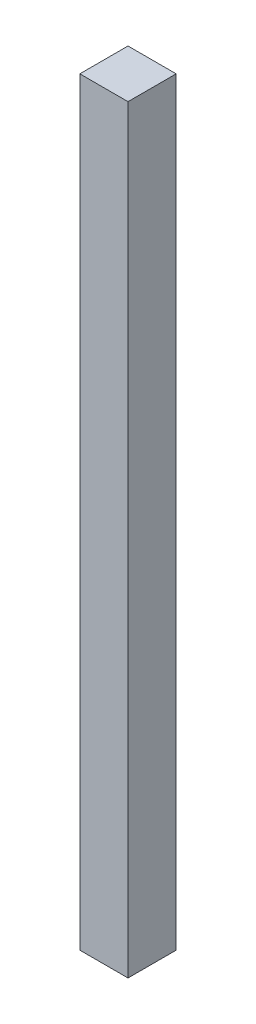
ISO-10303-21;
HEADER;
FILE_DESCRIPTION(('STEP AP214'),'2;1');
FILE_NAME('part.step','',(''),(''),'','','');
FILE_SCHEMA(('AUTOMOTIVE_DESIGN { 1 0 10303 214 1 1 1 1 }'));
ENDSEC;
DATA;
#1=APPLICATION_CONTEXT('core data for automotive mechanical design processes');
#2=APPLICATION_PROTOCOL_DEFINITION('international standard','automotive_design',2000,#1);
#3=PRODUCT_CONTEXT('',#1,'mechanical');
#4=PRODUCT('Part','Part','',(#3));
#5=PRODUCT_RELATED_PRODUCT_CATEGORY('part','',(#4));
#6=PRODUCT_DEFINITION_FORMATION('','',#4);
#7=PRODUCT_DEFINITION_CONTEXT('part definition',#1,'design');
#8=PRODUCT_DEFINITION('design','',#6,#7);
#9=PRODUCT_DEFINITION_SHAPE('','',#8);
#10=(LENGTH_UNIT() NAMED_UNIT(*) SI_UNIT(.MILLI.,.METRE.));
#11=(NAMED_UNIT(*) PLANE_ANGLE_UNIT() SI_UNIT($,.RADIAN.));
#12=(NAMED_UNIT(*) SI_UNIT($,.STERADIAN.) SOLID_ANGLE_UNIT());
#13=UNCERTAINTY_MEASURE_WITH_UNIT(LENGTH_MEASURE(1.E-05),#10,'distance_accuracy_value','');
#14=(GEOMETRIC_REPRESENTATION_CONTEXT(3) GLOBAL_UNCERTAINTY_ASSIGNED_CONTEXT((#13)) GLOBAL_UNIT_ASSIGNED_CONTEXT((#10,
#11,#12)) REPRESENTATION_CONTEXT('',''));
#15=CARTESIAN_POINT('',(0.,0.,0.));
#16=DIRECTION('',(0.,0.,1.));
#17=DIRECTION('',(1.,0.,0.));
#18=AXIS2_PLACEMENT_3D('',#15,#16,#17);
#19=CARTESIAN_POINT('',(-2.,63.,-2.));
#20=DIRECTION('',(1.,0.,0.));
#21=DIRECTION('',(0.,0.,-1.));
#22=AXIS2_PLACEMENT_3D('',#19,#20,#21);
#23=PLANE('',#22);
#24=DIRECTION('',(0.,0.,1.));
#25=VECTOR('',#24,1.);
#26=CARTESIAN_POINT('',(-2.,0.,-2.));
#27=LINE('',#26,#25);
#28=CARTESIAN_POINT('',(-2.,0.,-2.));
#29=VERTEX_POINT('',#28);
#30=CARTESIAN_POINT('',(-2.,0.,2.));
#31=VERTEX_POINT('',#30);
#32=EDGE_CURVE('E107',#29,#31,#27,.T.);
#33=ORIENTED_EDGE('',*,*,#32,.T.);
#34=DIRECTION('',(0.,-1.,0.));
#35=VECTOR('',#34,1.);
#36=CARTESIAN_POINT('',(-2.,63.,2.));
#37=LINE('',#36,#35);
#38=CARTESIAN_POINT('',(-2.,63.,2.));
#39=VERTEX_POINT('',#38);
#40=EDGE_CURVE('E11',#39,#31,#37,.T.);
#41=ORIENTED_EDGE('',*,*,#40,.F.);
#42=DIRECTION('',(0.,0.,1.));
#43=VECTOR('',#42,1.);
#44=CARTESIAN_POINT('',(-2.,63.,-2.));
#45=LINE('',#44,#43);
#46=CARTESIAN_POINT('',(-2.,63.,-2.));
#47=VERTEX_POINT('',#46);
#48=EDGE_CURVE('E91',#47,#39,#45,.T.);
#49=ORIENTED_EDGE('',*,*,#48,.F.);
#50=DIRECTION('',(0.,-1.,0.));
#51=VECTOR('',#50,1.);
#52=CARTESIAN_POINT('',(-2.,63.,-2.));
#53=LINE('',#52,#51);
#54=EDGE_CURVE('E103',#47,#29,#53,.T.);
#55=ORIENTED_EDGE('',*,*,#54,.T.);
#56=EDGE_LOOP('',(#33,#41,#49,#55));
#57=FACE_BOUND('',#56,.T.);
#58=ADVANCED_FACE('F39',(#57),#23,.F.);
#59=CARTESIAN_POINT('',(2.,63.,2.));
#60=DIRECTION('',(0.,0.,-1.));
#61=DIRECTION('',(-1.,0.,0.));
#62=AXIS2_PLACEMENT_3D('',#59,#60,#61);
#63=PLANE('',#62);
#64=DIRECTION('',(1.,0.,0.));
#65=VECTOR('',#64,1.);
#66=CARTESIAN_POINT('',(2.,0.,2.));
#67=LINE('',#66,#65);
#68=CARTESIAN_POINT('',(2.,0.,2.));
#69=VERTEX_POINT('',#68);
#70=EDGE_CURVE('E96',#31,#69,#67,.T.);
#71=ORIENTED_EDGE('',*,*,#70,.T.);
#72=DIRECTION('',(0.,-1.,0.));
#73=VECTOR('',#72,1.);
#74=CARTESIAN_POINT('',(2.,63.,2.));
#75=LINE('',#74,#73);
#76=CARTESIAN_POINT('',(2.,63.,2.));
#77=VERTEX_POINT('',#76);
#78=EDGE_CURVE('E48',#77,#69,#75,.T.);
#79=ORIENTED_EDGE('',*,*,#78,.F.);
#80=DIRECTION('',(1.,0.,0.));
#81=VECTOR('',#80,1.);
#82=CARTESIAN_POINT('',(2.,63.,2.));
#83=LINE('',#82,#81);
#84=EDGE_CURVE('E86',#39,#77,#83,.T.);
#85=ORIENTED_EDGE('',*,*,#84,.F.);
#86=ORIENTED_EDGE('',*,*,#40,.T.);
#87=EDGE_LOOP('',(#71,#79,#85,#86));
#88=FACE_BOUND('',#87,.T.);
#89=ADVANCED_FACE('F95',(#88),#63,.F.);
#90=CARTESIAN_POINT('',(2.,63.,-2.));
#91=DIRECTION('',(-1.,0.,0.));
#92=DIRECTION('',(0.,0.,1.));
#93=AXIS2_PLACEMENT_3D('',#90,#91,#92);
#94=PLANE('',#93);
#95=DIRECTION('',(0.,0.,-1.));
#96=VECTOR('',#95,1.);
#97=CARTESIAN_POINT('',(2.,0.,-2.));
#98=LINE('',#97,#96);
#99=CARTESIAN_POINT('',(2.,0.,-2.));
#100=VERTEX_POINT('',#99);
#101=EDGE_CURVE('E73',#69,#100,#98,.T.);
#102=ORIENTED_EDGE('',*,*,#101,.T.);
#103=DIRECTION('',(0.,-1.,0.));
#104=VECTOR('',#103,1.);
#105=CARTESIAN_POINT('',(2.,63.,-2.));
#106=LINE('',#105,#104);
#107=CARTESIAN_POINT('',(2.,63.,-2.));
#108=VERTEX_POINT('',#107);
#109=EDGE_CURVE('E98',#108,#100,#106,.T.);
#110=ORIENTED_EDGE('',*,*,#109,.F.);
#111=DIRECTION('',(0.,0.,-1.));
#112=VECTOR('',#111,1.);
#113=CARTESIAN_POINT('',(2.,63.,-2.));
#114=LINE('',#113,#112);
#115=EDGE_CURVE('E89',#77,#108,#114,.T.);
#116=ORIENTED_EDGE('',*,*,#115,.F.);
#117=ORIENTED_EDGE('',*,*,#78,.T.);
#118=EDGE_LOOP('',(#102,#110,#116,#117));
#119=FACE_BOUND('',#118,.T.);
#120=ADVANCED_FACE('F99',(#119),#94,.F.);
#121=CARTESIAN_POINT('',(2.,63.,-2.));
#122=DIRECTION('',(0.,0.,1.));
#123=DIRECTION('',(1.,0.,0.));
#124=AXIS2_PLACEMENT_3D('',#121,#122,#123);
#125=PLANE('',#124);
#126=DIRECTION('',(-1.,0.,0.));
#127=VECTOR('',#126,1.);
#128=CARTESIAN_POINT('',(2.,0.,-2.));
#129=LINE('',#128,#127);
#130=EDGE_CURVE('E79',#100,#29,#129,.T.);
#131=ORIENTED_EDGE('',*,*,#130,.T.);
#132=ORIENTED_EDGE('',*,*,#54,.F.);
#133=DIRECTION('',(-1.,0.,0.));
#134=VECTOR('',#133,1.);
#135=CARTESIAN_POINT('',(2.,63.,-2.));
#136=LINE('',#135,#134);
#137=EDGE_CURVE('E56',#108,#47,#136,.T.);
#138=ORIENTED_EDGE('',*,*,#137,.F.);
#139=ORIENTED_EDGE('',*,*,#109,.T.);
#140=EDGE_LOOP('',(#131,#132,#138,#139));
#141=FACE_BOUND('',#140,.T.);
#142=ADVANCED_FACE('F120',(#141),#125,.F.);
#143=CARTESIAN_POINT('',(0.,63.,0.));
#144=DIRECTION('',(0.,-1.,0.));
#145=DIRECTION('',(0.,0.,-1.));
#146=AXIS2_PLACEMENT_3D('',#143,#144,#145);
#147=PLANE('',#146);
#148=ORIENTED_EDGE('',*,*,#48,.T.);
#149=ORIENTED_EDGE('',*,*,#84,.T.);
#150=ORIENTED_EDGE('',*,*,#115,.T.);
#151=ORIENTED_EDGE('',*,*,#137,.T.);
#152=EDGE_LOOP('',(#148,#149,#150,#151));
#153=FACE_BOUND('',#152,.T.);
#154=ADVANCED_FACE('F87',(#153),#147,.F.);
#155=CARTESIAN_POINT('',(0.,0.,0.));
#156=DIRECTION('',(0.,-1.,0.));
#157=DIRECTION('',(0.,0.,-1.));
#158=AXIS2_PLACEMENT_3D('',#155,#156,#157);
#159=PLANE('',#158);
#160=ORIENTED_EDGE('',*,*,#32,.F.);
#161=ORIENTED_EDGE('',*,*,#130,.F.);
#162=ORIENTED_EDGE('',*,*,#101,.F.);
#163=ORIENTED_EDGE('',*,*,#70,.F.);
#164=EDGE_LOOP('',(#160,#161,#162,#163));
#165=FACE_BOUND('',#164,.T.);
#166=ADVANCED_FACE('F123',(#165),#159,.T.);
#167=CLOSED_SHELL('',(#58,#89,#120,#142,#154,#166));
#168=MANIFOLD_SOLID_BREP('B2',#167);
#169=ADVANCED_BREP_SHAPE_REPRESENTATION('',(#18,#168),#14);
#170=SHAPE_DEFINITION_REPRESENTATION(#9,#169);
ENDSEC;
END-ISO-10303-21;
